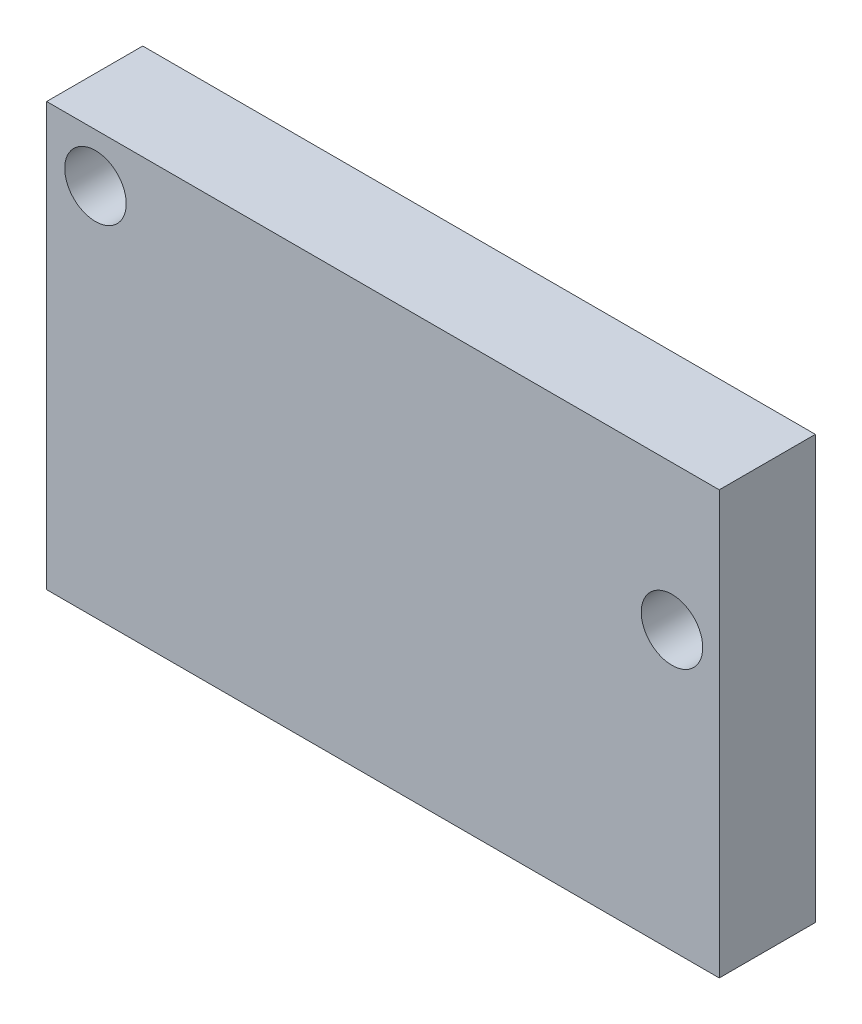
ISO-10303-21;
HEADER;
FILE_DESCRIPTION(('STEP AP214'),'2;1');
FILE_NAME('part.step','',(''),(''),'','','');
FILE_SCHEMA(('AUTOMOTIVE_DESIGN { 1 0 10303 214 1 1 1 1 }'));
ENDSEC;
DATA;
#1=APPLICATION_CONTEXT('core data for automotive mechanical design processes');
#2=APPLICATION_PROTOCOL_DEFINITION('international standard','automotive_design',2000,#1);
#3=PRODUCT_CONTEXT('',#1,'mechanical');
#4=PRODUCT('Part','Part','',(#3));
#5=PRODUCT_RELATED_PRODUCT_CATEGORY('part','',(#4));
#6=PRODUCT_DEFINITION_FORMATION('','',#4);
#7=PRODUCT_DEFINITION_CONTEXT('part definition',#1,'design');
#8=PRODUCT_DEFINITION('design','',#6,#7);
#9=PRODUCT_DEFINITION_SHAPE('','',#8);
#10=(LENGTH_UNIT() NAMED_UNIT(*) SI_UNIT(.MILLI.,.METRE.));
#11=(NAMED_UNIT(*) PLANE_ANGLE_UNIT() SI_UNIT($,.RADIAN.));
#12=(NAMED_UNIT(*) SI_UNIT($,.STERADIAN.) SOLID_ANGLE_UNIT());
#13=UNCERTAINTY_MEASURE_WITH_UNIT(LENGTH_MEASURE(1.E-05),#10,'distance_accuracy_value','');
#14=(GEOMETRIC_REPRESENTATION_CONTEXT(3) GLOBAL_UNCERTAINTY_ASSIGNED_CONTEXT((#13)) GLOBAL_UNIT_ASSIGNED_CONTEXT((#10,
#11,#12)) REPRESENTATION_CONTEXT('',''));
#15=CARTESIAN_POINT('',(0.,0.,0.));
#16=DIRECTION('',(0.,0.,1.));
#17=DIRECTION('',(1.,0.,0.));
#18=AXIS2_PLACEMENT_3D('',#15,#16,#17);
#19=CARTESIAN_POINT('',(0.,0.,5.));
#20=DIRECTION('',(0.,0.,1.));
#21=DIRECTION('',(1.,0.,0.));
#22=AXIS2_PLACEMENT_3D('',#19,#20,#21);
#23=PLANE('',#22);
#24=CARTESIAN_POINT('',(-32.46,19.46,5.));
#25=DIRECTION('',(0.,0.,1.));
#26=DIRECTION('',(1.,0.,0.));
#27=AXIS2_PLACEMENT_3D('',#24,#25,#26);
#28=CIRCLE('',#27,1.6);
#29=CARTESIAN_POINT('',(-30.86,19.46,5.));
#30=VERTEX_POINT('',#29);
#31=EDGE_CURVE('E116',#30,#30,#28,.T.);
#32=ORIENTED_EDGE('',*,*,#31,.F.);
#33=EDGE_LOOP('',(#32));
#34=FACE_BOUND('',#33,.T.);
#35=DIRECTION('',(0.,1.,0.));
#36=VECTOR('',#35,1.);
#37=CARTESIAN_POINT('',(0.,0.,5.));
#38=LINE('',#37,#36);
#39=CARTESIAN_POINT('',(0.,0.,5.));
#40=VERTEX_POINT('',#39);
#41=CARTESIAN_POINT('',(0.,22.,5.));
#42=VERTEX_POINT('',#41);
#43=EDGE_CURVE('E96',#40,#42,#38,.T.);
#44=ORIENTED_EDGE('',*,*,#43,.T.);
#45=DIRECTION('',(-1.,0.,0.));
#46=VECTOR('',#45,1.);
#47=CARTESIAN_POINT('',(0.,22.,5.));
#48=LINE('',#47,#46);
#49=CARTESIAN_POINT('',(-35.,22.,5.));
#50=VERTEX_POINT('',#49);
#51=EDGE_CURVE('E91',#42,#50,#48,.T.);
#52=ORIENTED_EDGE('',*,*,#51,.T.);
#53=DIRECTION('',(0.,-1.,0.));
#54=VECTOR('',#53,1.);
#55=CARTESIAN_POINT('',(-35.,0.,5.));
#56=LINE('',#55,#54);
#57=CARTESIAN_POINT('',(-35.,0.,5.));
#58=VERTEX_POINT('',#57);
#59=EDGE_CURVE('E94',#50,#58,#56,.T.);
#60=ORIENTED_EDGE('',*,*,#59,.T.);
#61=DIRECTION('',(1.,0.,0.));
#62=VECTOR('',#61,1.);
#63=CARTESIAN_POINT('',(0.,0.,5.));
#64=LINE('',#63,#62);
#65=EDGE_CURVE('E61',#58,#40,#64,.T.);
#66=ORIENTED_EDGE('',*,*,#65,.T.);
#67=EDGE_LOOP('',(#44,#52,#60,#66));
#68=FACE_BOUND('',#67,.T.);
#69=CARTESIAN_POINT('',(-2.46,14.46,5.));
#70=DIRECTION('',(0.,0.,1.));
#71=DIRECTION('',(1.,0.,0.));
#72=AXIS2_PLACEMENT_3D('',#69,#70,#71);
#73=CIRCLE('',#72,1.6);
#74=CARTESIAN_POINT('',(-0.860000000000003,14.46,5.));
#75=VERTEX_POINT('',#74);
#76=EDGE_CURVE('E138',#75,#75,#73,.T.);
#77=ORIENTED_EDGE('',*,*,#76,.F.);
#78=EDGE_LOOP('',(#77));
#79=FACE_BOUND('',#78,.T.);
#80=ADVANCED_FACE('F43',(#34,#68,#79),#23,.T.);
#81=CARTESIAN_POINT('',(0.,0.,0.));
#82=DIRECTION('',(0.,0.,1.));
#83=DIRECTION('',(1.,0.,0.));
#84=AXIS2_PLACEMENT_3D('',#81,#82,#83);
#85=PLANE('',#84);
#86=DIRECTION('',(0.,1.,0.));
#87=VECTOR('',#86,1.);
#88=CARTESIAN_POINT('',(0.,0.,0.));
#89=LINE('',#88,#87);
#90=CARTESIAN_POINT('',(0.,0.,0.));
#91=VERTEX_POINT('',#90);
#92=CARTESIAN_POINT('',(0.,22.,0.));
#93=VERTEX_POINT('',#92);
#94=EDGE_CURVE('E112',#91,#93,#89,.T.);
#95=ORIENTED_EDGE('',*,*,#94,.F.);
#96=DIRECTION('',(1.,0.,0.));
#97=VECTOR('',#96,1.);
#98=CARTESIAN_POINT('',(0.,0.,0.));
#99=LINE('',#98,#97);
#100=CARTESIAN_POINT('',(-35.,0.,0.));
#101=VERTEX_POINT('',#100);
#102=EDGE_CURVE('E84',#101,#91,#99,.T.);
#103=ORIENTED_EDGE('',*,*,#102,.F.);
#104=DIRECTION('',(0.,-1.,0.));
#105=VECTOR('',#104,1.);
#106=CARTESIAN_POINT('',(-35.,0.,0.));
#107=LINE('',#106,#105);
#108=CARTESIAN_POINT('',(-35.,22.,0.));
#109=VERTEX_POINT('',#108);
#110=EDGE_CURVE('E78',#109,#101,#107,.T.);
#111=ORIENTED_EDGE('',*,*,#110,.F.);
#112=DIRECTION('',(-1.,0.,0.));
#113=VECTOR('',#112,1.);
#114=CARTESIAN_POINT('',(0.,22.,0.));
#115=LINE('',#114,#113);
#116=EDGE_CURVE('E101',#93,#109,#115,.T.);
#117=ORIENTED_EDGE('',*,*,#116,.F.);
#118=EDGE_LOOP('',(#95,#103,#111,#117));
#119=FACE_BOUND('',#118,.T.);
#120=CARTESIAN_POINT('',(-32.46,19.46,0.));
#121=DIRECTION('',(0.,0.,1.));
#122=DIRECTION('',(1.,0.,0.));
#123=AXIS2_PLACEMENT_3D('',#120,#121,#122);
#124=CIRCLE('',#123,1.6);
#125=CARTESIAN_POINT('',(-30.86,19.46,0.));
#126=VERTEX_POINT('',#125);
#127=EDGE_CURVE('E134',#126,#126,#124,.T.);
#128=ORIENTED_EDGE('',*,*,#127,.T.);
#129=EDGE_LOOP('',(#128));
#130=FACE_BOUND('',#129,.T.);
#131=CARTESIAN_POINT('',(-2.46,14.46,0.));
#132=DIRECTION('',(0.,0.,1.));
#133=DIRECTION('',(1.,0.,0.));
#134=AXIS2_PLACEMENT_3D('',#131,#132,#133);
#135=CIRCLE('',#134,1.6);
#136=CARTESIAN_POINT('',(-0.860000000000003,14.46,0.));
#137=VERTEX_POINT('',#136);
#138=EDGE_CURVE('E142',#137,#137,#135,.T.);
#139=ORIENTED_EDGE('',*,*,#138,.T.);
#140=EDGE_LOOP('',(#139));
#141=FACE_BOUND('',#140,.T.);
#142=ADVANCED_FACE('F129',(#119,#130,#141),#85,.F.);
#143=CARTESIAN_POINT('',(0.,0.,5.));
#144=DIRECTION('',(-1.,0.,0.));
#145=DIRECTION('',(0.,-1.,0.));
#146=AXIS2_PLACEMENT_3D('',#143,#144,#145);
#147=PLANE('',#146);
#148=ORIENTED_EDGE('',*,*,#94,.T.);
#149=DIRECTION('',(0.,0.,-1.));
#150=VECTOR('',#149,1.);
#151=CARTESIAN_POINT('',(0.,22.,5.));
#152=LINE('',#151,#150);
#153=EDGE_CURVE('E11',#42,#93,#152,.T.);
#154=ORIENTED_EDGE('',*,*,#153,.F.);
#155=ORIENTED_EDGE('',*,*,#43,.F.);
#156=DIRECTION('',(0.,0.,-1.));
#157=VECTOR('',#156,1.);
#158=CARTESIAN_POINT('',(0.,0.,5.));
#159=LINE('',#158,#157);
#160=EDGE_CURVE('E108',#40,#91,#159,.T.);
#161=ORIENTED_EDGE('',*,*,#160,.T.);
#162=EDGE_LOOP('',(#148,#154,#155,#161));
#163=FACE_BOUND('',#162,.T.);
#164=ADVANCED_FACE('F45',(#163),#147,.F.);
#165=CARTESIAN_POINT('',(0.,22.,5.));
#166=DIRECTION('',(0.,-1.,0.));
#167=DIRECTION('',(1.,0.,0.));
#168=AXIS2_PLACEMENT_3D('',#165,#166,#167);
#169=PLANE('',#168);
#170=ORIENTED_EDGE('',*,*,#116,.T.);
#171=DIRECTION('',(0.,0.,-1.));
#172=VECTOR('',#171,1.);
#173=CARTESIAN_POINT('',(-35.,22.,5.));
#174=LINE('',#173,#172);
#175=EDGE_CURVE('E53',#50,#109,#174,.T.);
#176=ORIENTED_EDGE('',*,*,#175,.F.);
#177=ORIENTED_EDGE('',*,*,#51,.F.);
#178=ORIENTED_EDGE('',*,*,#153,.T.);
#179=EDGE_LOOP('',(#170,#176,#177,#178));
#180=FACE_BOUND('',#179,.T.);
#181=ADVANCED_FACE('F100',(#180),#169,.F.);
#182=CARTESIAN_POINT('',(-35.,0.,5.));
#183=DIRECTION('',(1.,0.,0.));
#184=DIRECTION('',(0.,0.,-1.));
#185=AXIS2_PLACEMENT_3D('',#182,#183,#184);
#186=PLANE('',#185);
#187=ORIENTED_EDGE('',*,*,#110,.T.);
#188=DIRECTION('',(0.,0.,-1.));
#189=VECTOR('',#188,1.);
#190=CARTESIAN_POINT('',(-35.,0.,5.));
#191=LINE('',#190,#189);
#192=EDGE_CURVE('E103',#58,#101,#191,.T.);
#193=ORIENTED_EDGE('',*,*,#192,.F.);
#194=ORIENTED_EDGE('',*,*,#59,.F.);
#195=ORIENTED_EDGE('',*,*,#175,.T.);
#196=EDGE_LOOP('',(#187,#193,#194,#195));
#197=FACE_BOUND('',#196,.T.);
#198=ADVANCED_FACE('F104',(#197),#186,.F.);
#199=CARTESIAN_POINT('',(0.,0.,5.));
#200=DIRECTION('',(0.,1.,0.));
#201=DIRECTION('',(0.,0.,1.));
#202=AXIS2_PLACEMENT_3D('',#199,#200,#201);
#203=PLANE('',#202);
#204=ORIENTED_EDGE('',*,*,#102,.T.);
#205=ORIENTED_EDGE('',*,*,#160,.F.);
#206=ORIENTED_EDGE('',*,*,#65,.F.);
#207=ORIENTED_EDGE('',*,*,#192,.T.);
#208=EDGE_LOOP('',(#204,#205,#206,#207));
#209=FACE_BOUND('',#208,.T.);
#210=ADVANCED_FACE('F126',(#209),#203,.F.);
#211=CARTESIAN_POINT('',(-32.46,19.46,5.));
#212=DIRECTION('',(0.,0.,-1.));
#213=DIRECTION('',(-1.,0.,0.));
#214=AXIS2_PLACEMENT_3D('',#211,#212,#213);
#215=CYLINDRICAL_SURFACE('',#214,1.6);
#216=ORIENTED_EDGE('',*,*,#31,.T.);
#217=EDGE_LOOP('',(#216));
#218=FACE_BOUND('',#217,.T.);
#219=ORIENTED_EDGE('',*,*,#127,.F.);
#220=EDGE_LOOP('',(#219));
#221=FACE_BOUND('',#220,.T.);
#222=ADVANCED_FACE('F161',(#218,#221),#215,.F.);
#223=CARTESIAN_POINT('',(-2.46,14.46,5.));
#224=DIRECTION('',(0.,0.,-1.));
#225=DIRECTION('',(-1.,0.,0.));
#226=AXIS2_PLACEMENT_3D('',#223,#224,#225);
#227=CYLINDRICAL_SURFACE('',#226,1.6);
#228=ORIENTED_EDGE('',*,*,#76,.T.);
#229=EDGE_LOOP('',(#228));
#230=FACE_BOUND('',#229,.T.);
#231=ORIENTED_EDGE('',*,*,#138,.F.);
#232=EDGE_LOOP('',(#231));
#233=FACE_BOUND('',#232,.T.);
#234=ADVANCED_FACE('F150',(#230,#233),#227,.F.);
#235=CLOSED_SHELL('',(#80,#142,#164,#181,#198,#210,#222,#234));
#236=MANIFOLD_SOLID_BREP('B2',#235);
#237=ADVANCED_BREP_SHAPE_REPRESENTATION('',(#18,#236),#14);
#238=SHAPE_DEFINITION_REPRESENTATION(#9,#237);
ENDSEC;
END-ISO-10303-21;
